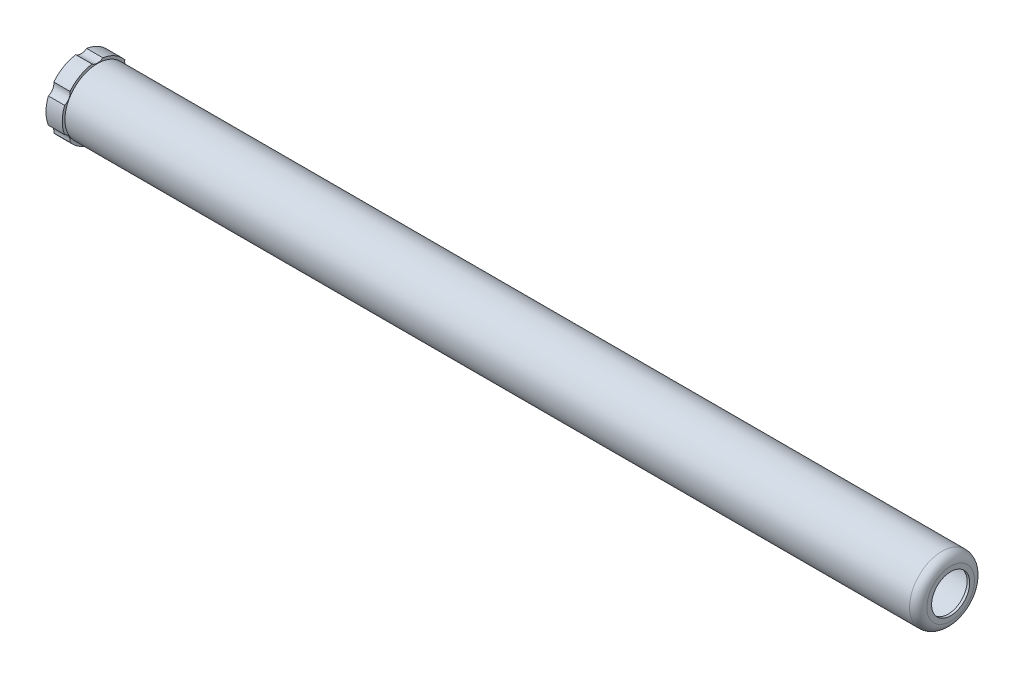
ISO-10303-21;
HEADER;
FILE_DESCRIPTION(('STEP AP214'),'2;1');
FILE_NAME('part.step','',(''),(''),'','','');
FILE_SCHEMA(('AUTOMOTIVE_DESIGN { 1 0 10303 214 1 1 1 1 }'));
ENDSEC;
DATA;
#1=APPLICATION_CONTEXT('core data for automotive mechanical design processes');
#2=APPLICATION_PROTOCOL_DEFINITION('international standard','automotive_design',2000,#1);
#3=PRODUCT_CONTEXT('',#1,'mechanical');
#4=PRODUCT('Part','Part','',(#3));
#5=PRODUCT_RELATED_PRODUCT_CATEGORY('part','',(#4));
#6=PRODUCT_DEFINITION_FORMATION('','',#4);
#7=PRODUCT_DEFINITION_CONTEXT('part definition',#1,'design');
#8=PRODUCT_DEFINITION('design','',#6,#7);
#9=PRODUCT_DEFINITION_SHAPE('','',#8);
#10=(LENGTH_UNIT() NAMED_UNIT(*) SI_UNIT(.MILLI.,.METRE.));
#11=(NAMED_UNIT(*) PLANE_ANGLE_UNIT() SI_UNIT($,.RADIAN.));
#12=(NAMED_UNIT(*) SI_UNIT($,.STERADIAN.) SOLID_ANGLE_UNIT());
#13=UNCERTAINTY_MEASURE_WITH_UNIT(LENGTH_MEASURE(1.E-05),#10,'distance_accuracy_value','');
#14=(GEOMETRIC_REPRESENTATION_CONTEXT(3) GLOBAL_UNCERTAINTY_ASSIGNED_CONTEXT((#13)) GLOBAL_UNIT_ASSIGNED_CONTEXT((#10,
#11,#12)) REPRESENTATION_CONTEXT('',''));
#15=CARTESIAN_POINT('',(0.,0.,0.));
#16=DIRECTION('',(0.,0.,1.));
#17=DIRECTION('',(1.,0.,0.));
#18=AXIS2_PLACEMENT_3D('',#15,#16,#17);
#19=CARTESIAN_POINT('',(-510.159,0.,0.));
#20=DIRECTION('',(1.,0.,0.));
#21=DIRECTION('',(0.,0.,-1.));
#22=AXIS2_PLACEMENT_3D('',#19,#20,#21);
#23=CYLINDRICAL_SURFACE('',#22,20.6375);
#24=CARTESIAN_POINT('',(-500.634,0.,0.));
#25=DIRECTION('',(-1.,0.,0.));
#26=DIRECTION('',(0.,0.,1.));
#27=AXIS2_PLACEMENT_3D('',#24,#25,#26);
#28=CIRCLE('',#27,20.6375);
#29=CARTESIAN_POINT('',(-500.634,12.945534016331,16.0723226473966));
#30=VERTEX_POINT('',#29);
#31=CARTESIAN_POINT('',(-500.634,20.3918067186309,3.175));
#32=VERTEX_POINT('',#31);
#33=EDGE_CURVE('E154',#30,#32,#28,.T.);
#34=ORIENTED_EDGE('',*,*,#33,.T.);
#35=DIRECTION('',(-1.,0.,0.));
#36=VECTOR('',#35,1.);
#37=CARTESIAN_POINT('',(-255.079506,20.3918067186309,3.175));
#38=LINE('',#37,#36);
#39=CARTESIAN_POINT('',(-510.159,20.3918067186309,3.175));
#40=VERTEX_POINT('',#39);
#41=EDGE_CURVE('E12',#32,#40,#38,.T.);
#42=ORIENTED_EDGE('',*,*,#41,.T.);
#43=CARTESIAN_POINT('',(-510.159,0.,0.));
#44=DIRECTION('',(-1.,0.,0.));
#45=DIRECTION('',(0.,0.,1.));
#46=AXIS2_PLACEMENT_3D('',#43,#44,#45);
#47=CIRCLE('',#46,20.6375);
#48=CARTESIAN_POINT('',(-510.159,12.945534016331,16.0723226473966));
#49=VERTEX_POINT('',#48);
#50=EDGE_CURVE('E171',#49,#40,#47,.T.);
#51=ORIENTED_EDGE('',*,*,#50,.F.);
#52=DIRECTION('',(-1.,0.,0.));
#53=VECTOR('',#52,1.);
#54=CARTESIAN_POINT('',(-255.079506,12.945534016331,16.0723226473966));
#55=LINE('',#54,#53);
#56=EDGE_CURVE('E144',#49,#30,#55,.F.);
#57=ORIENTED_EDGE('',*,*,#56,.T.);
#58=EDGE_LOOP('',(#34,#42,#51,#57));
#59=FACE_BOUND('',#58,.T.);
#60=ADVANCED_FACE('F44',(#59),#23,.T.);
#61=CARTESIAN_POINT('',(-510.159,20.3918067186309,-3.175));
#62=VERTEX_POINT('',#61);
#63=CARTESIAN_POINT('',(-510.159,12.9455340163312,-16.0723226473964));
#64=VERTEX_POINT('',#63);
#65=EDGE_CURVE('E280',#62,#64,#47,.T.);
#66=ORIENTED_EDGE('',*,*,#65,.F.);
#67=DIRECTION('',(-1.,0.,0.));
#68=VECTOR('',#67,1.);
#69=CARTESIAN_POINT('',(-255.079506,20.3918067186309,-3.175));
#70=LINE('',#69,#68);
#71=CARTESIAN_POINT('',(-500.634,20.3918067186309,-3.175));
#72=VERTEX_POINT('',#71);
#73=EDGE_CURVE('E52',#62,#72,#70,.F.);
#74=ORIENTED_EDGE('',*,*,#73,.T.);
#75=CARTESIAN_POINT('',(-500.634,12.9455340163312,-16.0723226473964));
#76=VERTEX_POINT('',#75);
#77=EDGE_CURVE('E168',#72,#76,#28,.T.);
#78=ORIENTED_EDGE('',*,*,#77,.T.);
#79=DIRECTION('',(-1.,0.,0.));
#80=VECTOR('',#79,1.);
#81=CARTESIAN_POINT('',(-255.079506,12.9455340163312,-16.0723226473964));
#82=LINE('',#81,#80);
#83=EDGE_CURVE('E299',#76,#64,#82,.T.);
#84=ORIENTED_EDGE('',*,*,#83,.T.);
#85=EDGE_LOOP('',(#66,#74,#78,#84));
#86=FACE_BOUND('',#85,.T.);
#87=ADVANCED_FACE('F235',(#86),#23,.T.);
#88=CARTESIAN_POINT('',(-510.159,7.44627270230007,-19.2473226473965));
#89=VERTEX_POINT('',#88);
#90=CARTESIAN_POINT('',(-510.159,-7.44627270229967,-19.2473226473966));
#91=VERTEX_POINT('',#90);
#92=EDGE_CURVE('E309',#89,#91,#47,.T.);
#93=ORIENTED_EDGE('',*,*,#92,.F.);
#94=DIRECTION('',(-1.,0.,0.));
#95=VECTOR('',#94,1.);
#96=CARTESIAN_POINT('',(-255.079506,7.44627270230008,-19.2473226473965));
#97=LINE('',#96,#95);
#98=CARTESIAN_POINT('',(-500.634,7.44627270230007,-19.2473226473965));
#99=VERTEX_POINT('',#98);
#100=EDGE_CURVE('E297',#89,#99,#97,.F.);
#101=ORIENTED_EDGE('',*,*,#100,.T.);
#102=CARTESIAN_POINT('',(-500.634,-7.44627270229967,-19.2473226473966));
#103=VERTEX_POINT('',#102);
#104=EDGE_CURVE('E173',#99,#103,#28,.T.);
#105=ORIENTED_EDGE('',*,*,#104,.T.);
#106=DIRECTION('',(-1.,0.,0.));
#107=VECTOR('',#106,1.);
#108=CARTESIAN_POINT('',(-255.079506,-7.44627270229967,-19.2473226473966));
#109=LINE('',#108,#107);
#110=EDGE_CURVE('E295',#103,#91,#109,.T.);
#111=ORIENTED_EDGE('',*,*,#110,.T.);
#112=EDGE_LOOP('',(#93,#101,#105,#111));
#113=FACE_BOUND('',#112,.T.);
#114=ADVANCED_FACE('F239',(#113),#23,.T.);
#115=CARTESIAN_POINT('',(-510.159,-12.9455340163309,-16.0723226473967));
#116=VERTEX_POINT('',#115);
#117=CARTESIAN_POINT('',(-510.159,-20.3918067186309,-3.17500000000015));
#118=VERTEX_POINT('',#117);
#119=EDGE_CURVE('E312',#116,#118,#47,.T.);
#120=ORIENTED_EDGE('',*,*,#119,.F.);
#121=DIRECTION('',(-1.,0.,0.));
#122=VECTOR('',#121,1.);
#123=CARTESIAN_POINT('',(-255.079506,-12.9455340163309,-16.0723226473967));
#124=LINE('',#123,#122);
#125=CARTESIAN_POINT('',(-500.634,-12.9455340163309,-16.0723226473967));
#126=VERTEX_POINT('',#125);
#127=EDGE_CURVE('E191',#116,#126,#124,.F.);
#128=ORIENTED_EDGE('',*,*,#127,.T.);
#129=CARTESIAN_POINT('',(-500.634,-20.3918067186309,-3.17500000000015));
#130=VERTEX_POINT('',#129);
#131=EDGE_CURVE('E161',#126,#130,#28,.T.);
#132=ORIENTED_EDGE('',*,*,#131,.T.);
#133=DIRECTION('',(-1.,0.,0.));
#134=VECTOR('',#133,1.);
#135=CARTESIAN_POINT('',(-255.079506,-20.3918067186309,-3.17500000000014));
#136=LINE('',#135,#134);
#137=EDGE_CURVE('E189',#130,#118,#136,.T.);
#138=ORIENTED_EDGE('',*,*,#137,.T.);
#139=EDGE_LOOP('',(#120,#128,#132,#138));
#140=FACE_BOUND('',#139,.T.);
#141=ADVANCED_FACE('F188',(#140),#23,.T.);
#142=CARTESIAN_POINT('',(-510.159,-20.3918067186309,3.17499999999985));
#143=VERTEX_POINT('',#142);
#144=CARTESIAN_POINT('',(-510.159,-12.9455340163311,16.0723226473965));
#145=VERTEX_POINT('',#144);
#146=EDGE_CURVE('E170',#143,#145,#47,.T.);
#147=ORIENTED_EDGE('',*,*,#146,.F.);
#148=DIRECTION('',(-1.,0.,0.));
#149=VECTOR('',#148,1.);
#150=CARTESIAN_POINT('',(-255.079506,-20.3918067186309,3.17499999999986));
#151=LINE('',#150,#149);
#152=CARTESIAN_POINT('',(-500.634,-20.3918067186309,3.17499999999986));
#153=VERTEX_POINT('',#152);
#154=EDGE_CURVE('E291',#143,#153,#151,.F.);
#155=ORIENTED_EDGE('',*,*,#154,.T.);
#156=CARTESIAN_POINT('',(-500.634,-12.9455340163311,16.0723226473965));
#157=VERTEX_POINT('',#156);
#158=EDGE_CURVE('E157',#153,#157,#28,.T.);
#159=ORIENTED_EDGE('',*,*,#158,.T.);
#160=DIRECTION('',(-1.,0.,0.));
#161=VECTOR('',#160,1.);
#162=CARTESIAN_POINT('',(-255.079506,-12.9455340163311,16.0723226473965));
#163=LINE('',#162,#161);
#164=EDGE_CURVE('E288',#157,#145,#163,.T.);
#165=ORIENTED_EDGE('',*,*,#164,.T.);
#166=EDGE_LOOP('',(#147,#155,#159,#165));
#167=FACE_BOUND('',#166,.T.);
#168=ADVANCED_FACE('F231',(#167),#23,.T.);
#169=CARTESIAN_POINT('',(-5.08,0.,0.));
#170=DIRECTION('',(-1.,0.,0.));
#171=DIRECTION('',(0.,0.,1.));
#172=AXIS2_PLACEMENT_3D('',#169,#170,#171);
#173=TOROIDAL_SURFACE('',#172,13.97,3.556);
#174=CARTESIAN_POINT('',(-1.52400000000003,0.,0.));
#175=DIRECTION('',(-1.,0.,0.));
#176=DIRECTION('',(0.,0.,1.));
#177=AXIS2_PLACEMENT_3D('',#174,#175,#176);
#178=CIRCLE('',#177,13.97);
#179=CARTESIAN_POINT('',(-1.52400000000003,0.,13.97));
#180=VERTEX_POINT('',#179);
#181=EDGE_CURVE('E275',#180,#180,#178,.T.);
#182=ORIENTED_EDGE('',*,*,#181,.F.);
#183=EDGE_LOOP('',(#182));
#184=FACE_BOUND('',#183,.T.);
#185=CARTESIAN_POINT('',(-5.08000000000003,0.,0.));
#186=DIRECTION('',(-1.,0.,0.));
#187=DIRECTION('',(0.,0.,1.));
#188=AXIS2_PLACEMENT_3D('',#185,#186,#187);
#189=CIRCLE('',#188,17.526);
#190=CARTESIAN_POINT('',(-5.08000000000003,0.,17.526));
#191=VERTEX_POINT('',#190);
#192=EDGE_CURVE('E271',#191,#191,#189,.T.);
#193=ORIENTED_EDGE('',*,*,#192,.T.);
#194=EDGE_LOOP('',(#193));
#195=FACE_BOUND('',#194,.T.);
#196=ADVANCED_FACE('F46',(#184,#195),#173,.F.);
#197=CARTESIAN_POINT('',(-484.828271432759,0.,0.));
#198=DIRECTION('',(-1.,0.,0.));
#199=DIRECTION('',(0.,0.,1.));
#200=AXIS2_PLACEMENT_3D('',#197,#198,#199);
#201=CYLINDRICAL_SURFACE('',#200,17.526);
#202=ORIENTED_EDGE('',*,*,#192,.F.);
#203=EDGE_LOOP('',(#202));
#204=FACE_BOUND('',#203,.T.);
#205=CARTESIAN_POINT('',(-500.634,0.,0.));
#206=DIRECTION('',(-1.,0.,0.));
#207=DIRECTION('',(0.,0.,1.));
#208=AXIS2_PLACEMENT_3D('',#205,#206,#207);
#209=CIRCLE('',#208,17.5259999999999);
#210=CARTESIAN_POINT('',(-500.634,0.,17.5259999999999));
#211=VERTEX_POINT('',#210);
#212=EDGE_CURVE('E274',#211,#211,#209,.T.);
#213=ORIENTED_EDGE('',*,*,#212,.T.);
#214=EDGE_LOOP('',(#213));
#215=FACE_BOUND('',#214,.T.);
#216=ADVANCED_FACE('F260',(#204,#215),#201,.F.);
#217=CARTESIAN_POINT('',(-484.828271432759,0.,0.));
#218=DIRECTION('',(-1.,0.,0.));
#219=DIRECTION('',(0.,0.,1.));
#220=AXIS2_PLACEMENT_3D('',#217,#218,#219);
#221=CYLINDRICAL_SURFACE('',#220,19.05);
#222=CARTESIAN_POINT('',(-500.634,0.,0.));
#223=DIRECTION('',(-1.,0.,0.));
#224=DIRECTION('',(0.,0.,1.));
#225=AXIS2_PLACEMENT_3D('',#222,#223,#224);
#226=CIRCLE('',#225,19.05);
#227=CARTESIAN_POINT('',(-500.634,0.,19.05));
#228=VERTEX_POINT('',#227);
#229=EDGE_CURVE('E283',#228,#228,#226,.T.);
#230=ORIENTED_EDGE('',*,*,#229,.F.);
#231=EDGE_LOOP('',(#230));
#232=FACE_BOUND('',#231,.T.);
#233=CARTESIAN_POINT('',(-5.08000000000003,0.,0.));
#234=DIRECTION('',(-1.,0.,0.));
#235=DIRECTION('',(0.,0.,1.));
#236=AXIS2_PLACEMENT_3D('',#233,#234,#235);
#237=CIRCLE('',#236,19.05);
#238=CARTESIAN_POINT('',(-5.08000000000003,0.,19.05));
#239=VERTEX_POINT('',#238);
#240=EDGE_CURVE('E540',#239,#239,#237,.T.);
#241=ORIENTED_EDGE('',*,*,#240,.T.);
#242=EDGE_LOOP('',(#241));
#243=FACE_BOUND('',#242,.T.);
#244=ADVANCED_FACE('F257',(#232,#243),#221,.T.);
#245=CARTESIAN_POINT('',(-5.08,0.,0.));
#246=DIRECTION('',(-1.,0.,0.));
#247=DIRECTION('',(0.,0.,1.));
#248=AXIS2_PLACEMENT_3D('',#245,#246,#247);
#249=TOROIDAL_SURFACE('',#248,13.97,5.08);
#250=ORIENTED_EDGE('',*,*,#240,.F.);
#251=EDGE_LOOP('',(#250));
#252=FACE_BOUND('',#251,.T.);
#253=CARTESIAN_POINT('',(0.,0.,0.));
#254=DIRECTION('',(-1.,0.,0.));
#255=DIRECTION('',(0.,0.,1.));
#256=AXIS2_PLACEMENT_3D('',#253,#254,#255);
#257=CIRCLE('',#256,13.97);
#258=CARTESIAN_POINT('',(0.,0.,13.97));
#259=VERTEX_POINT('',#258);
#260=EDGE_CURVE('E542',#259,#259,#257,.T.);
#261=ORIENTED_EDGE('',*,*,#260,.T.);
#262=EDGE_LOOP('',(#261));
#263=FACE_BOUND('',#262,.T.);
#264=ADVANCED_FACE('F253',(#252,#263),#249,.T.);
#265=CARTESIAN_POINT('',(0.,13.97,0.));
#266=DIRECTION('',(-1.,0.,0.));
#267=DIRECTION('',(0.,0.,1.));
#268=AXIS2_PLACEMENT_3D('',#265,#266,#267);
#269=PLANE('',#268);
#270=ORIENTED_EDGE('',*,*,#260,.F.);
#271=EDGE_LOOP('',(#270));
#272=FACE_BOUND('',#271,.T.);
#273=CARTESIAN_POINT('',(0.,0.,0.));
#274=DIRECTION('',(-1.,0.,0.));
#275=DIRECTION('',(0.,0.,1.));
#276=AXIS2_PLACEMENT_3D('',#273,#274,#275);
#277=CIRCLE('',#276,11.176);
#278=CARTESIAN_POINT('',(0.,0.,11.176));
#279=VERTEX_POINT('',#278);
#280=EDGE_CURVE('E546',#279,#279,#277,.T.);
#281=ORIENTED_EDGE('',*,*,#280,.T.);
#282=EDGE_LOOP('',(#281));
#283=FACE_BOUND('',#282,.T.);
#284=ADVANCED_FACE('F249',(#272,#283),#269,.F.);
#285=CARTESIAN_POINT('',(-484.828271432759,0.,0.));
#286=DIRECTION('',(-1.,0.,0.));
#287=DIRECTION('',(0.,0.,1.));
#288=AXIS2_PLACEMENT_3D('',#285,#286,#287);
#289=CYLINDRICAL_SURFACE('',#288,11.176);
#290=ORIENTED_EDGE('',*,*,#280,.F.);
#291=EDGE_LOOP('',(#290));
#292=FACE_BOUND('',#291,.T.);
#293=CARTESIAN_POINT('',(-1.52400000000003,0.,0.));
#294=DIRECTION('',(-1.,0.,0.));
#295=DIRECTION('',(0.,0.,1.));
#296=AXIS2_PLACEMENT_3D('',#293,#294,#295);
#297=CIRCLE('',#296,11.176);
#298=CARTESIAN_POINT('',(-1.52400000000003,0.,11.176));
#299=VERTEX_POINT('',#298);
#300=EDGE_CURVE('E278',#299,#299,#297,.T.);
#301=ORIENTED_EDGE('',*,*,#300,.T.);
#302=EDGE_LOOP('',(#301));
#303=FACE_BOUND('',#302,.T.);
#304=ADVANCED_FACE('F245',(#292,#303),#289,.F.);
#305=CARTESIAN_POINT('',(-1.524,13.97,0.));
#306=DIRECTION('',(1.,0.,0.));
#307=DIRECTION('',(0.,0.,-1.));
#308=AXIS2_PLACEMENT_3D('',#305,#306,#307);
#309=PLANE('',#308);
#310=ORIENTED_EDGE('',*,*,#300,.F.);
#311=EDGE_LOOP('',(#310));
#312=FACE_BOUND('',#311,.T.);
#313=ORIENTED_EDGE('',*,*,#181,.T.);
#314=EDGE_LOOP('',(#313));
#315=FACE_BOUND('',#314,.T.);
#316=ADVANCED_FACE('F242',(#312,#315),#309,.F.);
#317=CARTESIAN_POINT('',(-500.634,0.,0.));
#318=DIRECTION('',(-1.,0.,0.));
#319=DIRECTION('',(0.,0.,1.));
#320=AXIS2_PLACEMENT_3D('',#317,#318,#319);
#321=PLANE('',#320);
#322=CARTESIAN_POINT('',(-500.634,0.,0.));
#323=DIRECTION('',(-1.,0.,0.));
#324=DIRECTION('',(0.,0.,1.));
#325=AXIS2_PLACEMENT_3D('',#322,#323,#324);
#326=CIRCLE('',#325,15.875);
#327=CARTESIAN_POINT('',(-500.634,0.,-15.875));
#328=VERTEX_POINT('',#327);
#329=EDGE_CURVE('E163',#328,#328,#326,.T.);
#330=ORIENTED_EDGE('',*,*,#329,.T.);
#331=EDGE_LOOP('',(#330));
#332=FACE_BOUND('',#331,.T.);
#333=ORIENTED_EDGE('',*,*,#212,.F.);
#334=EDGE_LOOP('',(#333));
#335=FACE_BOUND('',#334,.T.);
#336=ADVANCED_FACE('F217',(#332,#335),#321,.F.);
#337=CARTESIAN_POINT('',(-510.159,0.,0.));
#338=DIRECTION('',(-1.,0.,0.));
#339=DIRECTION('',(0.,0.,1.));
#340=AXIS2_PLACEMENT_3D('',#337,#338,#339);
#341=PLANE('',#340);
#342=CARTESIAN_POINT('',(-510.159,24.3573804476139,0.));
#343=DIRECTION('',(-1.,0.,0.));
#344=DIRECTION('',(0.,0.,1.));
#345=AXIS2_PLACEMENT_3D('',#342,#343,#344);
#346=CIRCLE('',#345,5.08);
#347=EDGE_CURVE('E212',#62,#40,#346,.T.);
#348=ORIENTED_EDGE('',*,*,#347,.F.);
#349=ORIENTED_EDGE('',*,*,#65,.T.);
#350=CARTESIAN_POINT('',(-510.159,12.1786902238072,-21.0941102372759));
#351=DIRECTION('',(-1.,0.,0.));
#352=DIRECTION('',(0.,0.,1.));
#353=AXIS2_PLACEMENT_3D('',#350,#351,#352);
#354=CIRCLE('',#353,5.08);
#355=EDGE_CURVE('E208',#89,#64,#354,.T.);
#356=ORIENTED_EDGE('',*,*,#355,.F.);
#357=ORIENTED_EDGE('',*,*,#92,.T.);
#358=CARTESIAN_POINT('',(-510.159,-12.1786902238067,-21.0941102372761));
#359=DIRECTION('',(-1.,0.,0.));
#360=DIRECTION('',(0.,0.,1.));
#361=AXIS2_PLACEMENT_3D('',#358,#359,#360);
#362=CIRCLE('',#361,5.08);
#363=EDGE_CURVE('E203',#116,#91,#362,.T.);
#364=ORIENTED_EDGE('',*,*,#363,.F.);
#365=ORIENTED_EDGE('',*,*,#119,.T.);
#366=CARTESIAN_POINT('',(-510.159,-24.3573804476139,-1.70086678591893E-13));
#367=DIRECTION('',(-1.,0.,0.));
#368=DIRECTION('',(0.,0.,1.));
#369=AXIS2_PLACEMENT_3D('',#366,#367,#368);
#370=CIRCLE('',#369,5.08);
#371=EDGE_CURVE('E195',#143,#118,#370,.T.);
#372=ORIENTED_EDGE('',*,*,#371,.F.);
#373=ORIENTED_EDGE('',*,*,#146,.T.);
#374=CARTESIAN_POINT('',(-510.159,-12.178690223807,21.0941102372759));
#375=DIRECTION('',(-1.,0.,0.));
#376=DIRECTION('',(0.,0.,1.));
#377=AXIS2_PLACEMENT_3D('',#374,#375,#376);
#378=CIRCLE('',#377,5.08000000000001);
#379=CARTESIAN_POINT('',(-510.159,-7.44627270229995,19.2473226473965));
#380=VERTEX_POINT('',#379);
#381=EDGE_CURVE('E196',#380,#145,#378,.T.);
#382=ORIENTED_EDGE('',*,*,#381,.F.);
#383=CARTESIAN_POINT('',(-510.159,7.44627270229981,19.2473226473966));
#384=VERTEX_POINT('',#383);
#385=EDGE_CURVE('E167',#380,#384,#47,.T.);
#386=ORIENTED_EDGE('',*,*,#385,.T.);
#387=CARTESIAN_POINT('',(-510.159,12.1786902238069,21.094110237276));
#388=DIRECTION('',(-1.,0.,0.));
#389=DIRECTION('',(0.,0.,1.));
#390=AXIS2_PLACEMENT_3D('',#387,#388,#389);
#391=CIRCLE('',#390,5.08);
#392=EDGE_CURVE('E138',#49,#384,#391,.T.);
#393=ORIENTED_EDGE('',*,*,#392,.F.);
#394=ORIENTED_EDGE('',*,*,#50,.T.);
#395=EDGE_LOOP('',(#348,#349,#356,#357,#364,#365,#372,#373,#382,#386,#393,#394));
#396=FACE_BOUND('',#395,.T.);
#397=CARTESIAN_POINT('',(-510.159,0.,0.));
#398=DIRECTION('',(-1.,0.,0.));
#399=DIRECTION('',(0.,0.,1.));
#400=AXIS2_PLACEMENT_3D('',#397,#398,#399);
#401=CIRCLE('',#400,15.875);
#402=CARTESIAN_POINT('',(-510.159,0.,-15.875));
#403=VERTEX_POINT('',#402);
#404=EDGE_CURVE('E158',#403,#403,#401,.T.);
#405=ORIENTED_EDGE('',*,*,#404,.F.);
#406=EDGE_LOOP('',(#405));
#407=FACE_BOUND('',#406,.T.);
#408=ADVANCED_FACE('F317',(#396,#407),#341,.T.);
#409=ORIENTED_EDGE('',*,*,#229,.T.);
#410=EDGE_LOOP('',(#409));
#411=FACE_BOUND('',#410,.T.);
#412=ORIENTED_EDGE('',*,*,#77,.F.);
#413=CARTESIAN_POINT('',(-500.634,24.3573804476139,0.));
#414=DIRECTION('',(-1.,0.,0.));
#415=DIRECTION('',(0.,0.,1.));
#416=AXIS2_PLACEMENT_3D('',#413,#414,#415);
#417=CIRCLE('',#416,5.08);
#418=EDGE_CURVE('E210',#72,#32,#417,.T.);
#419=ORIENTED_EDGE('',*,*,#418,.T.);
#420=ORIENTED_EDGE('',*,*,#33,.F.);
#421=CARTESIAN_POINT('',(-500.634,12.1786902238069,21.094110237276));
#422=DIRECTION('',(-1.,0.,0.));
#423=DIRECTION('',(0.,0.,1.));
#424=AXIS2_PLACEMENT_3D('',#421,#422,#423);
#425=CIRCLE('',#424,5.08);
#426=CARTESIAN_POINT('',(-500.634,7.44627270229981,19.2473226473966));
#427=VERTEX_POINT('',#426);
#428=EDGE_CURVE('E135',#30,#427,#425,.T.);
#429=ORIENTED_EDGE('',*,*,#428,.T.);
#430=CARTESIAN_POINT('',(-500.634,-7.44627270229992,19.2473226473965));
#431=VERTEX_POINT('',#430);
#432=EDGE_CURVE('E151',#431,#427,#28,.T.);
#433=ORIENTED_EDGE('',*,*,#432,.F.);
#434=CARTESIAN_POINT('',(-500.634,-12.178690223807,21.0941102372759));
#435=DIRECTION('',(-1.,0.,0.));
#436=DIRECTION('',(0.,0.,1.));
#437=AXIS2_PLACEMENT_3D('',#434,#435,#436);
#438=CIRCLE('',#437,5.08000000000001);
#439=EDGE_CURVE('E59',#431,#157,#438,.T.);
#440=ORIENTED_EDGE('',*,*,#439,.T.);
#441=ORIENTED_EDGE('',*,*,#158,.F.);
#442=CARTESIAN_POINT('',(-500.634,-24.3573804476139,-1.70086678591893E-13));
#443=DIRECTION('',(-1.,0.,0.));
#444=DIRECTION('',(0.,0.,1.));
#445=AXIS2_PLACEMENT_3D('',#442,#443,#444);
#446=CIRCLE('',#445,5.08);
#447=EDGE_CURVE('E67',#153,#130,#446,.T.);
#448=ORIENTED_EDGE('',*,*,#447,.T.);
#449=ORIENTED_EDGE('',*,*,#131,.F.);
#450=CARTESIAN_POINT('',(-500.634,-12.1786902238067,-21.0941102372761));
#451=DIRECTION('',(-1.,0.,0.));
#452=DIRECTION('',(0.,0.,1.));
#453=AXIS2_PLACEMENT_3D('',#450,#451,#452);
#454=CIRCLE('',#453,5.08);
#455=EDGE_CURVE('E193',#126,#103,#454,.T.);
#456=ORIENTED_EDGE('',*,*,#455,.T.);
#457=ORIENTED_EDGE('',*,*,#104,.F.);
#458=CARTESIAN_POINT('',(-500.634,12.1786902238072,-21.0941102372759));
#459=DIRECTION('',(-1.,0.,0.));
#460=DIRECTION('',(0.,0.,1.));
#461=AXIS2_PLACEMENT_3D('',#458,#459,#460);
#462=CIRCLE('',#461,5.08);
#463=EDGE_CURVE('E205',#99,#76,#462,.T.);
#464=ORIENTED_EDGE('',*,*,#463,.T.);
#465=EDGE_LOOP('',(#412,#419,#420,#429,#433,#440,#441,#448,#449,#456,#457,#464));
#466=FACE_BOUND('',#465,.T.);
#467=ADVANCED_FACE('F150',(#411,#466),#321,.F.);
#468=ORIENTED_EDGE('',*,*,#385,.F.);
#469=DIRECTION('',(-1.,0.,0.));
#470=VECTOR('',#469,1.);
#471=CARTESIAN_POINT('',(-255.079506,-7.44627270229994,19.2473226473965));
#472=LINE('',#471,#470);
#473=EDGE_CURVE('E143',#380,#431,#472,.F.);
#474=ORIENTED_EDGE('',*,*,#473,.T.);
#475=ORIENTED_EDGE('',*,*,#432,.T.);
#476=DIRECTION('',(-1.,0.,0.));
#477=VECTOR('',#476,1.);
#478=CARTESIAN_POINT('',(-255.079506,7.4462727022998,19.2473226473966));
#479=LINE('',#478,#477);
#480=EDGE_CURVE('E132',#427,#384,#479,.T.);
#481=ORIENTED_EDGE('',*,*,#480,.T.);
#482=EDGE_LOOP('',(#468,#474,#475,#481));
#483=FACE_BOUND('',#482,.T.);
#484=ADVANCED_FACE('F156',(#483),#23,.T.);
#485=CARTESIAN_POINT('',(-510.159,0.,0.));
#486=DIRECTION('',(1.,0.,0.));
#487=DIRECTION('',(0.,0.,-1.));
#488=AXIS2_PLACEMENT_3D('',#485,#486,#487);
#489=CYLINDRICAL_SURFACE('',#488,15.875);
#490=CARTESIAN_POINT('',(-510.159,0.,-15.875));
#491=CARTESIAN_POINT('',(-510.05978125,0.,-15.875));
#492=CARTESIAN_POINT('',(-509.9605625,0.,-15.875));
#493=CARTESIAN_POINT('',(-509.762125,0.,-15.875));
#494=CARTESIAN_POINT('',(-509.66290625,0.,-15.875));
#495=CARTESIAN_POINT('',(-509.46446875,0.,-15.875));
#496=CARTESIAN_POINT('',(-509.36525,0.,-15.875));
#497=CARTESIAN_POINT('',(-509.1668125,0.,-15.875));
#498=CARTESIAN_POINT('',(-509.06759375,0.,-15.875));
#499=CARTESIAN_POINT('',(-508.86915625,0.,-15.875));
#500=CARTESIAN_POINT('',(-508.7699375,0.,-15.875));
#501=CARTESIAN_POINT('',(-508.5715,0.,-15.875));
#502=CARTESIAN_POINT('',(-508.47228125,0.,-15.875));
#503=CARTESIAN_POINT('',(-508.27384375,0.,-15.875));
#504=CARTESIAN_POINT('',(-508.174625,0.,-15.875));
#505=CARTESIAN_POINT('',(-507.9761875,0.,-15.875));
#506=CARTESIAN_POINT('',(-507.87696875,0.,-15.875));
#507=CARTESIAN_POINT('',(-507.67853125,0.,-15.875));
#508=CARTESIAN_POINT('',(-507.5793125,0.,-15.875));
#509=CARTESIAN_POINT('',(-507.380875,0.,-15.875));
#510=CARTESIAN_POINT('',(-507.28165625,0.,-15.875));
#511=CARTESIAN_POINT('',(-507.08321875,0.,-15.875));
#512=CARTESIAN_POINT('',(-506.984,0.,-15.875));
#513=CARTESIAN_POINT('',(-506.7855625,0.,-15.875));
#514=CARTESIAN_POINT('',(-506.68634375,0.,-15.875));
#515=CARTESIAN_POINT('',(-506.48790625,0.,-15.875));
#516=CARTESIAN_POINT('',(-506.3886875,0.,-15.875));
#517=CARTESIAN_POINT('',(-506.19025,0.,-15.875));
#518=CARTESIAN_POINT('',(-506.09103125,0.,-15.875));
#519=CARTESIAN_POINT('',(-505.89259375,0.,-15.875));
#520=CARTESIAN_POINT('',(-505.793375,0.,-15.875));
#521=CARTESIAN_POINT('',(-505.5949375,0.,-15.875));
#522=CARTESIAN_POINT('',(-505.49571875,0.,-15.875));
#523=CARTESIAN_POINT('',(-505.29728125,0.,-15.875));
#524=CARTESIAN_POINT('',(-505.1980625,0.,-15.875));
#525=CARTESIAN_POINT('',(-504.999625,0.,-15.875));
#526=CARTESIAN_POINT('',(-504.90040625,0.,-15.875));
#527=CARTESIAN_POINT('',(-504.70196875,0.,-15.875));
#528=CARTESIAN_POINT('',(-504.60275,0.,-15.875));
#529=CARTESIAN_POINT('',(-504.4043125,0.,-15.875));
#530=CARTESIAN_POINT('',(-504.30509375,0.,-15.875));
#531=CARTESIAN_POINT('',(-504.10665625,0.,-15.875));
#532=CARTESIAN_POINT('',(-504.0074375,0.,-15.875));
#533=CARTESIAN_POINT('',(-503.809,0.,-15.875));
#534=CARTESIAN_POINT('',(-503.70978125,0.,-15.875));
#535=CARTESIAN_POINT('',(-503.51134375,0.,-15.875));
#536=CARTESIAN_POINT('',(-503.412125,0.,-15.875));
#537=CARTESIAN_POINT('',(-503.2136875,0.,-15.875));
#538=CARTESIAN_POINT('',(-503.11446875,0.,-15.875));
#539=CARTESIAN_POINT('',(-502.91603125,0.,-15.875));
#540=CARTESIAN_POINT('',(-502.8168125,0.,-15.875));
#541=CARTESIAN_POINT('',(-502.618375,0.,-15.875));
#542=CARTESIAN_POINT('',(-502.51915625,0.,-15.875));
#543=CARTESIAN_POINT('',(-502.32071875,0.,-15.875));
#544=CARTESIAN_POINT('',(-502.2215,0.,-15.875));
#545=CARTESIAN_POINT('',(-502.0230625,0.,-15.875));
#546=CARTESIAN_POINT('',(-501.92384375,0.,-15.875));
#547=CARTESIAN_POINT('',(-501.72540625,0.,-15.875));
#548=CARTESIAN_POINT('',(-501.6261875,0.,-15.875));
#549=CARTESIAN_POINT('',(-501.42775,0.,-15.875));
#550=CARTESIAN_POINT('',(-501.32853125,0.,-15.875));
#551=CARTESIAN_POINT('',(-501.13009375,0.,-15.875));
#552=CARTESIAN_POINT('',(-501.030875,0.,-15.875));
#553=CARTESIAN_POINT('',(-500.8324375,0.,-15.875));
#554=CARTESIAN_POINT('',(-500.73321875,0.,-15.875));
#555=CARTESIAN_POINT('',(-500.634,0.,-15.875));
#556=B_SPLINE_CURVE_WITH_KNOTS('',3,(#490,#491,#492,#493,#494,#495,#496,#497,#498,#499,#500,
#501,#502,#503,#504,#505,#506,#507,#508,#509,#510,#511,#512,#513,#514,#515,#516,#517,#518,#519,
#520,#521,#522,#523,#524,#525,#526,#527,#528,#529,#530,#531,#532,#533,#534,#535,#536,#537,#538,
#539,#540,#541,#542,#543,#544,#545,#546,#547,#548,#549,#550,#551,#552,#553,#554,#555),
.UNSPECIFIED.,.F.,.F.,(4,2,2,2,2,2,2,2,2,2,2,2,2,2,2,2,2,2,2,2,2,2,2,2,2,2,2,2,2,2,2,2,4),(0.,
0.297656250000111,0.595312500000111,0.892968750000112,1.19062500000011,1.48828125000011,
1.78593750000011,2.08359375000011,2.38125000000011,2.67890625000011,2.97656250000011,
3.27421875000011,3.57187500000011,3.86953125000011,4.16718750000011,4.46484375000011,
4.76250000000011,5.06015625000011,5.35781250000011,5.65546875000011,5.95312500000011,
6.25078125000011,6.54843750000011,6.84609375000012,7.14375000000012,7.44140625000012,
7.73906250000012,8.03671875000012,8.33437500000012,8.63203125000012,8.92968750000012,
9.22734375000012,9.52500000000012),.UNSPECIFIED.);
#557=EDGE_CURVE('BSEAM220',#403,#328,#556,.T.);
#558=ORIENTED_EDGE('',*,*,#404,.T.);
#559=ORIENTED_EDGE('',*,*,#329,.F.);
#560=ORIENTED_EDGE('',*,*,#557,.T.);
#561=ORIENTED_EDGE('',*,*,#557,.F.);
#562=EDGE_LOOP('',(#558,#560,#559,#561));
#563=FACE_BOUND('',#562,.T.);
#564=ADVANCED_FACE('F220',(#563),#489,.F.);
#565=CARTESIAN_POINT('',(0.,12.1786902238069,21.094110237276));
#566=DIRECTION('',(-1.,0.,0.));
#567=DIRECTION('',(0.,0.,1.));
#568=AXIS2_PLACEMENT_3D('',#565,#566,#567);
#569=CYLINDRICAL_SURFACE('',#568,5.08);
#570=ORIENTED_EDGE('',*,*,#392,.T.);
#571=ORIENTED_EDGE('',*,*,#480,.F.);
#572=ORIENTED_EDGE('',*,*,#428,.F.);
#573=ORIENTED_EDGE('',*,*,#56,.F.);
#574=EDGE_LOOP('',(#570,#571,#572,#573));
#575=FACE_BOUND('',#574,.T.);
#576=ADVANCED_FACE('F134',(#575),#569,.F.);
#577=CARTESIAN_POINT('',(0.,-12.178690223807,21.0941102372759));
#578=DIRECTION('',(-1.,0.,0.));
#579=DIRECTION('',(0.,0.,1.));
#580=AXIS2_PLACEMENT_3D('',#577,#578,#579);
#581=CYLINDRICAL_SURFACE('',#580,5.08000000000001);
#582=ORIENTED_EDGE('',*,*,#381,.T.);
#583=ORIENTED_EDGE('',*,*,#164,.F.);
#584=ORIENTED_EDGE('',*,*,#439,.F.);
#585=ORIENTED_EDGE('',*,*,#473,.F.);
#586=EDGE_LOOP('',(#582,#583,#584,#585));
#587=FACE_BOUND('',#586,.T.);
#588=ADVANCED_FACE('F228',(#587),#581,.F.);
#589=CARTESIAN_POINT('',(0.,-24.3573804476139,-1.70086678591893E-13));
#590=DIRECTION('',(-1.,0.,0.));
#591=DIRECTION('',(0.,0.,1.));
#592=AXIS2_PLACEMENT_3D('',#589,#590,#591);
#593=CYLINDRICAL_SURFACE('',#592,5.08);
#594=ORIENTED_EDGE('',*,*,#371,.T.);
#595=ORIENTED_EDGE('',*,*,#137,.F.);
#596=ORIENTED_EDGE('',*,*,#447,.F.);
#597=ORIENTED_EDGE('',*,*,#154,.F.);
#598=EDGE_LOOP('',(#594,#595,#596,#597));
#599=FACE_BOUND('',#598,.T.);
#600=ADVANCED_FACE('F322',(#599),#593,.F.);
#601=CARTESIAN_POINT('',(0.,-12.1786902238067,-21.0941102372761));
#602=DIRECTION('',(-1.,0.,0.));
#603=DIRECTION('',(0.,0.,1.));
#604=AXIS2_PLACEMENT_3D('',#601,#602,#603);
#605=CYLINDRICAL_SURFACE('',#604,5.08);
#606=ORIENTED_EDGE('',*,*,#363,.T.);
#607=ORIENTED_EDGE('',*,*,#110,.F.);
#608=ORIENTED_EDGE('',*,*,#455,.F.);
#609=ORIENTED_EDGE('',*,*,#127,.F.);
#610=EDGE_LOOP('',(#606,#607,#608,#609));
#611=FACE_BOUND('',#610,.T.);
#612=ADVANCED_FACE('F327',(#611),#605,.F.);
#613=CARTESIAN_POINT('',(0.,12.1786902238072,-21.0941102372759));
#614=DIRECTION('',(-1.,0.,0.));
#615=DIRECTION('',(0.,0.,1.));
#616=AXIS2_PLACEMENT_3D('',#613,#614,#615);
#617=CYLINDRICAL_SURFACE('',#616,5.08);
#618=ORIENTED_EDGE('',*,*,#355,.T.);
#619=ORIENTED_EDGE('',*,*,#83,.F.);
#620=ORIENTED_EDGE('',*,*,#463,.F.);
#621=ORIENTED_EDGE('',*,*,#100,.F.);
#622=EDGE_LOOP('',(#618,#619,#620,#621));
#623=FACE_BOUND('',#622,.T.);
#624=ADVANCED_FACE('F305',(#623),#617,.F.);
#625=CARTESIAN_POINT('',(0.,24.3573804476139,0.));
#626=DIRECTION('',(-1.,0.,0.));
#627=DIRECTION('',(0.,0.,1.));
#628=AXIS2_PLACEMENT_3D('',#625,#626,#627);
#629=CYLINDRICAL_SURFACE('',#628,5.08);
#630=ORIENTED_EDGE('',*,*,#347,.T.);
#631=ORIENTED_EDGE('',*,*,#41,.F.);
#632=ORIENTED_EDGE('',*,*,#418,.F.);
#633=ORIENTED_EDGE('',*,*,#73,.F.);
#634=EDGE_LOOP('',(#630,#631,#632,#633));
#635=FACE_BOUND('',#634,.T.);
#636=ADVANCED_FACE('F335',(#635),#629,.F.);
#637=CLOSED_SHELL('',(#60,#87,#114,#141,#168,#196,#216,#244,#264,#284,#304,#316,#336,#408,#467,
#484,#564,#576,#588,#600,#612,#624,#636));
#638=MANIFOLD_SOLID_BREP('B2',#637);
#639=ADVANCED_BREP_SHAPE_REPRESENTATION('',(#18,#638),#14);
#640=SHAPE_DEFINITION_REPRESENTATION(#9,#639);
ENDSEC;
END-ISO-10303-21;
